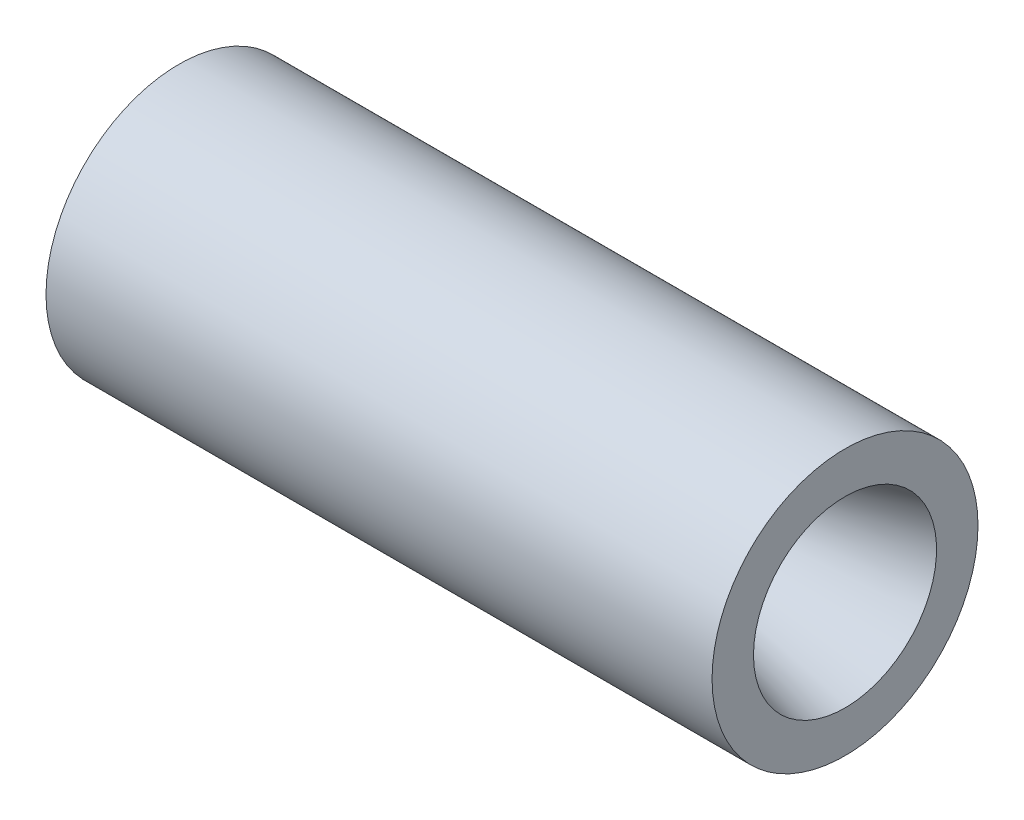
ISO-10303-21;
HEADER;
FILE_DESCRIPTION(('STEP AP214'),'2;1');
FILE_NAME('part.step','',(''),(''),'','','');
FILE_SCHEMA(('AUTOMOTIVE_DESIGN { 1 0 10303 214 1 1 1 1 }'));
ENDSEC;
DATA;
#1=APPLICATION_CONTEXT('core data for automotive mechanical design processes');
#2=APPLICATION_PROTOCOL_DEFINITION('international standard','automotive_design',2000,#1);
#3=PRODUCT_CONTEXT('',#1,'mechanical');
#4=PRODUCT('Part','Part','',(#3));
#5=PRODUCT_RELATED_PRODUCT_CATEGORY('part','',(#4));
#6=PRODUCT_DEFINITION_FORMATION('','',#4);
#7=PRODUCT_DEFINITION_CONTEXT('part definition',#1,'design');
#8=PRODUCT_DEFINITION('design','',#6,#7);
#9=PRODUCT_DEFINITION_SHAPE('','',#8);
#10=(LENGTH_UNIT() NAMED_UNIT(*) SI_UNIT(.MILLI.,.METRE.));
#11=(NAMED_UNIT(*) PLANE_ANGLE_UNIT() SI_UNIT($,.RADIAN.));
#12=(NAMED_UNIT(*) SI_UNIT($,.STERADIAN.) SOLID_ANGLE_UNIT());
#13=UNCERTAINTY_MEASURE_WITH_UNIT(LENGTH_MEASURE(1.E-05),#10,'distance_accuracy_value','');
#14=(GEOMETRIC_REPRESENTATION_CONTEXT(3) GLOBAL_UNCERTAINTY_ASSIGNED_CONTEXT((#13)) GLOBAL_UNIT_ASSIGNED_CONTEXT((#10,
#11,#12)) REPRESENTATION_CONTEXT('',''));
#15=CARTESIAN_POINT('',(0.,0.,0.));
#16=DIRECTION('',(0.,0.,1.));
#17=DIRECTION('',(1.,0.,0.));
#18=AXIS2_PLACEMENT_3D('',#15,#16,#17);
#19=CARTESIAN_POINT('',(0.,53.34,0.));
#20=DIRECTION('',(1.,0.,0.));
#21=DIRECTION('',(0.,0.,-1.));
#22=AXIS2_PLACEMENT_3D('',#19,#20,#21);
#23=PLANE('',#22);
#24=CARTESIAN_POINT('',(0.,0.,0.));
#25=DIRECTION('',(-1.,0.,0.));
#26=DIRECTION('',(0.,0.,1.));
#27=AXIS2_PLACEMENT_3D('',#24,#25,#26);
#28=CIRCLE('',#27,43.2765708);
#29=CARTESIAN_POINT('',(0.,0.,43.2765708));
#30=VERTEX_POINT('',#29);
#31=EDGE_CURVE('E62',#30,#30,#28,.T.);
#32=ORIENTED_EDGE('',*,*,#31,.F.);
#33=EDGE_LOOP('',(#32));
#34=FACE_BOUND('',#33,.T.);
#35=CARTESIAN_POINT('',(0.,0.,0.));
#36=DIRECTION('',(-1.,0.,0.));
#37=DIRECTION('',(0.,0.,1.));
#38=AXIS2_PLACEMENT_3D('',#35,#36,#37);
#39=CIRCLE('',#38,53.34);
#40=CARTESIAN_POINT('',(0.,0.,53.34));
#41=VERTEX_POINT('',#40);
#42=EDGE_CURVE('E10',#41,#41,#39,.T.);
#43=ORIENTED_EDGE('',*,*,#42,.T.);
#44=EDGE_LOOP('',(#43));
#45=FACE_BOUND('',#44,.T.);
#46=ADVANCED_FACE('F34',(#34,#45),#23,.F.);
#47=CARTESIAN_POINT('',(0.,0.,0.));
#48=DIRECTION('',(-1.,0.,0.));
#49=DIRECTION('',(0.,0.,1.));
#50=AXIS2_PLACEMENT_3D('',#47,#48,#49);
#51=CYLINDRICAL_SURFACE('',#50,53.34);
#52=ORIENTED_EDGE('',*,*,#42,.F.);
#53=EDGE_LOOP('',(#52));
#54=FACE_BOUND('',#53,.T.);
#55=CARTESIAN_POINT('',(267.174285764213,0.,0.));
#56=DIRECTION('',(-1.,0.,0.));
#57=DIRECTION('',(0.,0.,1.));
#58=AXIS2_PLACEMENT_3D('',#55,#56,#57);
#59=CIRCLE('',#58,53.34);
#60=CARTESIAN_POINT('',(267.174285764213,0.,53.34));
#61=VERTEX_POINT('',#60);
#62=EDGE_CURVE('E40',#61,#61,#59,.T.);
#63=ORIENTED_EDGE('',*,*,#62,.T.);
#64=EDGE_LOOP('',(#63));
#65=FACE_BOUND('',#64,.T.);
#66=ADVANCED_FACE('F69',(#54,#65),#51,.T.);
#67=CARTESIAN_POINT('',(267.174285764213,36.7237391,0.));
#68=DIRECTION('',(-1.,0.,0.));
#69=DIRECTION('',(0.,0.,1.));
#70=AXIS2_PLACEMENT_3D('',#67,#68,#69);
#71=PLANE('',#70);
#72=ORIENTED_EDGE('',*,*,#62,.F.);
#73=EDGE_LOOP('',(#72));
#74=FACE_BOUND('',#73,.T.);
#75=CARTESIAN_POINT('',(267.174285764213,0.,0.));
#76=DIRECTION('',(-1.,0.,0.));
#77=DIRECTION('',(0.,0.,1.));
#78=AXIS2_PLACEMENT_3D('',#75,#76,#77);
#79=CIRCLE('',#78,36.7237391);
#80=CARTESIAN_POINT('',(267.174285764213,0.,36.7237391));
#81=VERTEX_POINT('',#80);
#82=EDGE_CURVE('E44',#81,#81,#79,.T.);
#83=ORIENTED_EDGE('',*,*,#82,.T.);
#84=EDGE_LOOP('',(#83));
#85=FACE_BOUND('',#84,.T.);
#86=ADVANCED_FACE('F73',(#74,#85),#71,.F.);
#87=CARTESIAN_POINT('',(195.627584967739,0.,0.));
#88=DIRECTION('',(1.,0.,0.));
#89=DIRECTION('',(0.,0.,-1.));
#90=AXIS2_PLACEMENT_3D('',#87,#88,#89);
#91=CONICAL_SURFACE('',#90,17.5528584004737,0.26179938779915);
#92=ORIENTED_EDGE('',*,*,#82,.F.);
#93=EDGE_LOOP('',(#92));
#94=FACE_BOUND('',#93,.T.);
#95=CARTESIAN_POINT('',(195.627584967739,0.,0.));
#96=DIRECTION('',(-1.,0.,0.));
#97=DIRECTION('',(0.,0.,1.));
#98=AXIS2_PLACEMENT_3D('',#95,#96,#97);
#99=CIRCLE('',#98,17.5528584004737);
#100=CARTESIAN_POINT('',(195.627584967739,0.,17.5528584004737));
#101=VERTEX_POINT('',#100);
#102=EDGE_CURVE('E48',#101,#101,#99,.T.);
#103=ORIENTED_EDGE('',*,*,#102,.T.);
#104=EDGE_LOOP('',(#103));
#105=FACE_BOUND('',#104,.T.);
#106=ADVANCED_FACE('F78',(#94,#105),#91,.F.);
#107=CARTESIAN_POINT('',(191.234269511724,0.,0.));
#108=DIRECTION('',(-1.,0.,0.));
#109=DIRECTION('',(0.,0.,1.));
#110=AXIS2_PLACEMENT_3D('',#107,#108,#109);
#111=TOROIDAL_SURFACE('',#110,33.948934896,16.974467448);
#112=ORIENTED_EDGE('',*,*,#102,.F.);
#113=EDGE_LOOP('',(#112));
#114=FACE_BOUND('',#113,.T.);
#115=CARTESIAN_POINT('',(181.498114963943,0.,0.));
#116=DIRECTION('',(-1.,0.,0.));
#117=DIRECTION('',(0.,0.,1.));
#118=AXIS2_PLACEMENT_3D('',#115,#116,#117);
#119=CIRCLE('',#118,20.0442651852539);
#120=CARTESIAN_POINT('',(181.498114963943,0.,20.0442651852539));
#121=VERTEX_POINT('',#120);
#122=EDGE_CURVE('E53',#121,#121,#119,.T.);
#123=ORIENTED_EDGE('',*,*,#122,.T.);
#124=EDGE_LOOP('',(#123));
#125=FACE_BOUND('',#124,.T.);
#126=ADVANCED_FACE('F84',(#114,#125),#111,.T.);
#127=CARTESIAN_POINT('',(152.703069527781,0.,0.));
#128=DIRECTION('',(-1.,0.,0.));
#129=DIRECTION('',(0.,0.,1.));
#130=AXIS2_PLACEMENT_3D('',#127,#128,#129);
#131=CONICAL_SURFACE('',#130,40.2067730627461,0.610865238198016);
#132=ORIENTED_EDGE('',*,*,#122,.F.);
#133=EDGE_LOOP('',(#132));
#134=FACE_BOUND('',#133,.T.);
#135=CARTESIAN_POINT('',(152.703069527781,0.,0.));
#136=DIRECTION('',(-1.,0.,0.));
#137=DIRECTION('',(0.,0.,1.));
#138=AXIS2_PLACEMENT_3D('',#135,#136,#137);
#139=CIRCLE('',#138,40.2067730627461);
#140=CARTESIAN_POINT('',(152.703069527781,0.,40.2067730627461));
#141=VERTEX_POINT('',#140);
#142=EDGE_CURVE('E56',#141,#141,#139,.T.);
#143=ORIENTED_EDGE('',*,*,#142,.T.);
#144=EDGE_LOOP('',(#143));
#145=FACE_BOUND('',#144,.T.);
#146=ADVANCED_FACE('F88',(#134,#145),#131,.F.);
#147=CARTESIAN_POINT('',(142.96691498,0.,0.));
#148=DIRECTION('',(-1.,0.,0.));
#149=DIRECTION('',(0.,0.,1.));
#150=AXIS2_PLACEMENT_3D('',#147,#148,#149);
#151=TOROIDAL_SURFACE('',#150,26.302103352,16.974467448);
#152=ORIENTED_EDGE('',*,*,#142,.F.);
#153=EDGE_LOOP('',(#152));
#154=FACE_BOUND('',#153,.T.);
#155=CARTESIAN_POINT('',(142.96691498,0.,0.));
#156=DIRECTION('',(-1.,0.,0.));
#157=DIRECTION('',(0.,0.,1.));
#158=AXIS2_PLACEMENT_3D('',#155,#156,#157);
#159=CIRCLE('',#158,43.2765708);
#160=CARTESIAN_POINT('',(142.96691498,0.,43.2765708));
#161=VERTEX_POINT('',#160);
#162=EDGE_CURVE('E59',#161,#161,#159,.T.);
#163=ORIENTED_EDGE('',*,*,#162,.T.);
#164=EDGE_LOOP('',(#163));
#165=FACE_BOUND('',#164,.T.);
#166=ADVANCED_FACE('F92',(#154,#165),#151,.F.);
#167=CARTESIAN_POINT('',(0.,0.,0.));
#168=DIRECTION('',(-1.,0.,0.));
#169=DIRECTION('',(0.,0.,1.));
#170=AXIS2_PLACEMENT_3D('',#167,#168,#169);
#171=CYLINDRICAL_SURFACE('',#170,43.2765708);
#172=ORIENTED_EDGE('',*,*,#162,.F.);
#173=EDGE_LOOP('',(#172));
#174=FACE_BOUND('',#173,.T.);
#175=ORIENTED_EDGE('',*,*,#31,.T.);
#176=EDGE_LOOP('',(#175));
#177=FACE_BOUND('',#176,.T.);
#178=ADVANCED_FACE('F66',(#174,#177),#171,.F.);
#179=CLOSED_SHELL('',(#46,#66,#86,#106,#126,#146,#166,#178));
#180=MANIFOLD_SOLID_BREP('B2',#179);
#181=ADVANCED_BREP_SHAPE_REPRESENTATION('',(#18,#180),#14);
#182=SHAPE_DEFINITION_REPRESENTATION(#9,#181);
ENDSEC;
END-ISO-10303-21;
